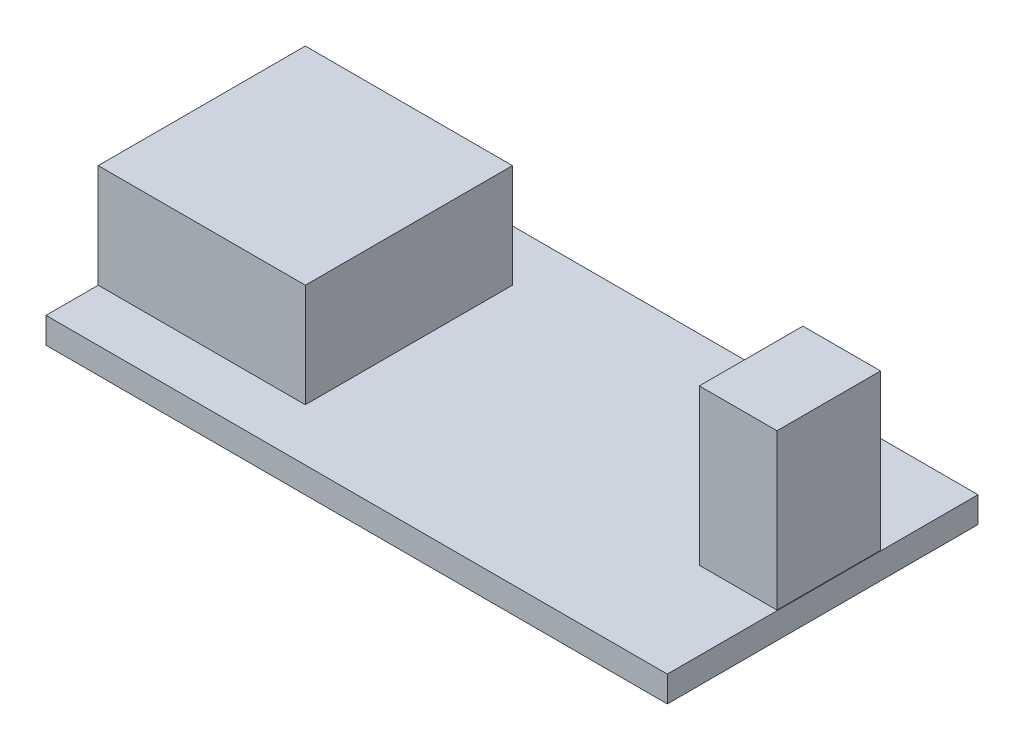
ISO-10303-21;
HEADER;
FILE_DESCRIPTION(('STEP AP214'),'2;1');
FILE_NAME('part.step','',(''),(''),'','','');
FILE_SCHEMA(('AUTOMOTIVE_DESIGN { 1 0 10303 214 1 1 1 1 }'));
ENDSEC;
DATA;
#1=APPLICATION_CONTEXT('core data for automotive mechanical design processes');
#2=APPLICATION_PROTOCOL_DEFINITION('international standard','automotive_design',2000,#1);
#3=PRODUCT_CONTEXT('',#1,'mechanical');
#4=PRODUCT('Part','Part','',(#3));
#5=PRODUCT_RELATED_PRODUCT_CATEGORY('part','',(#4));
#6=PRODUCT_DEFINITION_FORMATION('','',#4);
#7=PRODUCT_DEFINITION_CONTEXT('part definition',#1,'design');
#8=PRODUCT_DEFINITION('design','',#6,#7);
#9=PRODUCT_DEFINITION_SHAPE('','',#8);
#10=(LENGTH_UNIT() NAMED_UNIT(*) SI_UNIT(.MILLI.,.METRE.));
#11=(NAMED_UNIT(*) PLANE_ANGLE_UNIT() SI_UNIT($,.RADIAN.));
#12=(NAMED_UNIT(*) SI_UNIT($,.STERADIAN.) SOLID_ANGLE_UNIT());
#13=UNCERTAINTY_MEASURE_WITH_UNIT(LENGTH_MEASURE(1.E-05),#10,'distance_accuracy_value','');
#14=(GEOMETRIC_REPRESENTATION_CONTEXT(3) GLOBAL_UNCERTAINTY_ASSIGNED_CONTEXT((#13)) GLOBAL_UNIT_ASSIGNED_CONTEXT((#10,
#11,#12)) REPRESENTATION_CONTEXT('',''));
#15=CARTESIAN_POINT('',(0.,0.,0.));
#16=DIRECTION('',(0.,0.,1.));
#17=DIRECTION('',(1.,0.,0.));
#18=AXIS2_PLACEMENT_3D('',#15,#16,#17);
#19=CARTESIAN_POINT('',(0.,12.7,0.));
#20=DIRECTION('',(0.,-1.,0.));
#21=DIRECTION('',(0.,0.,-1.));
#22=AXIS2_PLACEMENT_3D('',#19,#20,#21);
#23=PLANE('',#22);
#24=DIRECTION('',(0.,0.,1.));
#25=VECTOR('',#24,1.);
#26=CARTESIAN_POINT('',(114.020932653844,12.7,-28.6671947155262));
#27=LINE('',#26,#25);
#28=CARTESIAN_POINT('',(114.020932653844,12.7,-28.6671947155262));
#29=VERTEX_POINT('',#28);
#30=CARTESIAN_POINT('',(114.020932653844,12.7,22.1328052844738));
#31=VERTEX_POINT('',#30);
#32=EDGE_CURVE('E155',#29,#31,#27,.T.);
#33=ORIENTED_EDGE('',*,*,#32,.F.);
#34=DIRECTION('',(-1.,0.,0.));
#35=VECTOR('',#34,1.);
#36=CARTESIAN_POINT('',(114.020932653844,12.7,-28.6671947155262));
#37=LINE('',#36,#35);
#38=CARTESIAN_POINT('',(152.120932653844,12.7,-28.6671947155262));
#39=VERTEX_POINT('',#38);
#40=EDGE_CURVE('E168',#39,#29,#37,.T.);
#41=ORIENTED_EDGE('',*,*,#40,.F.);
#42=DIRECTION('',(0.,0.,-1.));
#43=VECTOR('',#42,1.);
#44=CARTESIAN_POINT('',(152.120932653844,12.7,-28.6671947155262));
#45=LINE('',#44,#43);
#46=CARTESIAN_POINT('',(152.120932653844,12.7,22.1328052844738));
#47=VERTEX_POINT('',#46);
#48=EDGE_CURVE('E177',#47,#39,#45,.T.);
#49=ORIENTED_EDGE('',*,*,#48,.F.);
#50=DIRECTION('',(1.,0.,0.));
#51=VECTOR('',#50,1.);
#52=CARTESIAN_POINT('',(114.020932653844,12.7,22.1328052844738));
#53=LINE('',#52,#51);
#54=EDGE_CURVE('E158',#31,#47,#53,.T.);
#55=ORIENTED_EDGE('',*,*,#54,.F.);
#56=EDGE_LOOP('',(#33,#41,#49,#55));
#57=FACE_BOUND('',#56,.T.);
#58=DIRECTION('',(1.,0.,0.));
#59=VECTOR('',#58,1.);
#60=CARTESIAN_POINT('',(-50.8,12.7,50.5821110994876));
#61=LINE('',#60,#59);
#62=CARTESIAN_POINT('',(-152.4,12.7,50.5821110994876));
#63=VERTEX_POINT('',#62);
#64=CARTESIAN_POINT('',(-50.8,12.7,50.5821110994876));
#65=VERTEX_POINT('',#64);
#66=EDGE_CURVE('E232',#63,#65,#61,.T.);
#67=ORIENTED_EDGE('',*,*,#66,.F.);
#68=DIRECTION('',(0.,0.,1.));
#69=VECTOR('',#68,1.);
#70=CARTESIAN_POINT('',(-152.4,12.7,76.2));
#71=LINE('',#70,#69);
#72=CARTESIAN_POINT('',(-152.4,12.7,76.2));
#73=VERTEX_POINT('',#72);
#74=EDGE_CURVE('E154',#63,#73,#71,.T.);
#75=ORIENTED_EDGE('',*,*,#74,.T.);
#76=DIRECTION('',(1.,0.,0.));
#77=VECTOR('',#76,1.);
#78=CARTESIAN_POINT('',(-152.4,12.7,76.2));
#79=LINE('',#78,#77);
#80=CARTESIAN_POINT('',(152.4,12.7,76.2));
#81=VERTEX_POINT('',#80);
#82=EDGE_CURVE('E202',#73,#81,#79,.T.);
#83=ORIENTED_EDGE('',*,*,#82,.T.);
#84=DIRECTION('',(0.,0.,-1.));
#85=VECTOR('',#84,1.);
#86=CARTESIAN_POINT('',(152.4,12.7,76.2));
#87=LINE('',#86,#85);
#88=CARTESIAN_POINT('',(152.4,12.7,-76.2));
#89=VERTEX_POINT('',#88);
#90=EDGE_CURVE('E194',#81,#89,#87,.T.);
#91=ORIENTED_EDGE('',*,*,#90,.T.);
#92=DIRECTION('',(-1.,0.,0.));
#93=VECTOR('',#92,1.);
#94=CARTESIAN_POINT('',(-152.4,12.7,-76.2));
#95=LINE('',#94,#93);
#96=CARTESIAN_POINT('',(-152.4,12.7,-76.2));
#97=VERTEX_POINT('',#96);
#98=EDGE_CURVE('E197',#89,#97,#95,.T.);
#99=ORIENTED_EDGE('',*,*,#98,.T.);
#100=CARTESIAN_POINT('',(-152.4,12.7,-51.0178889005123));
#101=VERTEX_POINT('',#100);
#102=EDGE_CURVE('E200',#97,#101,#71,.T.);
#103=ORIENTED_EDGE('',*,*,#102,.T.);
#104=DIRECTION('',(-1.,0.,0.));
#105=VECTOR('',#104,1.);
#106=CARTESIAN_POINT('',(-50.8,12.7,-51.0178889005124));
#107=LINE('',#106,#105);
#108=CARTESIAN_POINT('',(-50.8,12.7,-51.0178889005124));
#109=VERTEX_POINT('',#108);
#110=EDGE_CURVE('E64',#109,#101,#107,.T.);
#111=ORIENTED_EDGE('',*,*,#110,.F.);
#112=DIRECTION('',(0.,0.,-1.));
#113=VECTOR('',#112,1.);
#114=CARTESIAN_POINT('',(-50.8,12.7,50.5821110994876));
#115=LINE('',#114,#113);
#116=EDGE_CURVE('E59',#65,#109,#115,.T.);
#117=ORIENTED_EDGE('',*,*,#116,.F.);
#118=EDGE_LOOP('',(#67,#75,#83,#91,#99,#103,#111,#117));
#119=FACE_BOUND('',#118,.T.);
#120=ADVANCED_FACE('F44',(#57,#119),#23,.F.);
#121=CARTESIAN_POINT('',(152.4,12.7,76.2));
#122=DIRECTION('',(-1.,0.,0.));
#123=DIRECTION('',(0.,0.,1.));
#124=AXIS2_PLACEMENT_3D('',#121,#122,#123);
#125=PLANE('',#124);
#126=DIRECTION('',(0.,0.,-1.));
#127=VECTOR('',#126,1.);
#128=CARTESIAN_POINT('',(152.4,0.,76.2));
#129=LINE('',#128,#127);
#130=CARTESIAN_POINT('',(152.4,0.,76.2));
#131=VERTEX_POINT('',#130);
#132=CARTESIAN_POINT('',(152.4,0.,-76.2));
#133=VERTEX_POINT('',#132);
#134=EDGE_CURVE('E193',#131,#133,#129,.T.);
#135=ORIENTED_EDGE('',*,*,#134,.T.);
#136=DIRECTION('',(0.,-1.,0.));
#137=VECTOR('',#136,1.);
#138=CARTESIAN_POINT('',(152.4,12.7,-76.2));
#139=LINE('',#138,#137);
#140=EDGE_CURVE('E11',#89,#133,#139,.T.);
#141=ORIENTED_EDGE('',*,*,#140,.F.);
#142=ORIENTED_EDGE('',*,*,#90,.F.);
#143=DIRECTION('',(0.,-1.,0.));
#144=VECTOR('',#143,1.);
#145=CARTESIAN_POINT('',(152.4,12.7,76.2));
#146=LINE('',#145,#144);
#147=EDGE_CURVE('E204',#81,#131,#146,.T.);
#148=ORIENTED_EDGE('',*,*,#147,.T.);
#149=EDGE_LOOP('',(#135,#141,#142,#148));
#150=FACE_BOUND('',#149,.T.);
#151=ADVANCED_FACE('F46',(#150),#125,.F.);
#152=CARTESIAN_POINT('',(-152.4,12.7,-76.2));
#153=DIRECTION('',(0.,0.,1.));
#154=DIRECTION('',(1.,0.,0.));
#155=AXIS2_PLACEMENT_3D('',#152,#153,#154);
#156=PLANE('',#155);
#157=DIRECTION('',(-1.,0.,0.));
#158=VECTOR('',#157,1.);
#159=CARTESIAN_POINT('',(-152.4,0.,-76.2));
#160=LINE('',#159,#158);
#161=CARTESIAN_POINT('',(-152.4,0.,-76.2));
#162=VERTEX_POINT('',#161);
#163=EDGE_CURVE('E207',#133,#162,#160,.T.);
#164=ORIENTED_EDGE('',*,*,#163,.T.);
#165=DIRECTION('',(0.,-1.,0.));
#166=VECTOR('',#165,1.);
#167=CARTESIAN_POINT('',(-152.4,12.7,-76.2));
#168=LINE('',#167,#166);
#169=EDGE_CURVE('E52',#97,#162,#168,.T.);
#170=ORIENTED_EDGE('',*,*,#169,.F.);
#171=ORIENTED_EDGE('',*,*,#98,.F.);
#172=ORIENTED_EDGE('',*,*,#140,.T.);
#173=EDGE_LOOP('',(#164,#170,#171,#172));
#174=FACE_BOUND('',#173,.T.);
#175=ADVANCED_FACE('F261',(#174),#156,.F.);
#176=CARTESIAN_POINT('',(-152.4,12.7,76.2));
#177=DIRECTION('',(1.,0.,0.));
#178=DIRECTION('',(0.,0.,-1.));
#179=AXIS2_PLACEMENT_3D('',#176,#177,#178);
#180=PLANE('',#179);
#181=DIRECTION('',(0.,0.,1.));
#182=VECTOR('',#181,1.);
#183=CARTESIAN_POINT('',(-152.4,0.,76.2));
#184=LINE('',#183,#182);
#185=CARTESIAN_POINT('',(-152.4,0.,76.2));
#186=VERTEX_POINT('',#185);
#187=EDGE_CURVE('E209',#162,#186,#184,.T.);
#188=ORIENTED_EDGE('',*,*,#187,.T.);
#189=DIRECTION('',(0.,-1.,0.));
#190=VECTOR('',#189,1.);
#191=CARTESIAN_POINT('',(-152.4,12.7,76.2));
#192=LINE('',#191,#190);
#193=EDGE_CURVE('E214',#73,#186,#192,.T.);
#194=ORIENTED_EDGE('',*,*,#193,.F.);
#195=ORIENTED_EDGE('',*,*,#74,.F.);
#196=DIRECTION('',(0.,-1.,0.));
#197=VECTOR('',#196,1.);
#198=CARTESIAN_POINT('',(-152.4,63.5,50.5821110994876));
#199=LINE('',#198,#197);
#200=CARTESIAN_POINT('',(-152.4,63.5,50.5821110994876));
#201=VERTEX_POINT('',#200);
#202=EDGE_CURVE('E136',#201,#63,#199,.T.);
#203=ORIENTED_EDGE('',*,*,#202,.F.);
#204=DIRECTION('',(0.,0.,1.));
#205=VECTOR('',#204,1.);
#206=CARTESIAN_POINT('',(-152.4,63.5,50.5821110994876));
#207=LINE('',#206,#205);
#208=CARTESIAN_POINT('',(-152.4,63.5,-51.0178889005124));
#209=VERTEX_POINT('',#208);
#210=EDGE_CURVE('E142',#209,#201,#207,.T.);
#211=ORIENTED_EDGE('',*,*,#210,.F.);
#212=DIRECTION('',(0.,-1.,0.));
#213=VECTOR('',#212,1.);
#214=CARTESIAN_POINT('',(-152.4,63.5,-51.0178889005124));
#215=LINE('',#214,#213);
#216=EDGE_CURVE('E239',#209,#101,#215,.T.);
#217=ORIENTED_EDGE('',*,*,#216,.T.);
#218=ORIENTED_EDGE('',*,*,#102,.F.);
#219=ORIENTED_EDGE('',*,*,#169,.T.);
#220=EDGE_LOOP('',(#188,#194,#195,#203,#211,#217,#218,#219));
#221=FACE_BOUND('',#220,.T.);
#222=ADVANCED_FACE('F152',(#221),#180,.F.);
#223=CARTESIAN_POINT('',(-152.4,12.7,76.2));
#224=DIRECTION('',(0.,0.,-1.));
#225=DIRECTION('',(-1.,0.,0.));
#226=AXIS2_PLACEMENT_3D('',#223,#224,#225);
#227=PLANE('',#226);
#228=DIRECTION('',(1.,0.,0.));
#229=VECTOR('',#228,1.);
#230=CARTESIAN_POINT('',(-152.4,0.,76.2));
#231=LINE('',#230,#229);
#232=EDGE_CURVE('E198',#186,#131,#231,.T.);
#233=ORIENTED_EDGE('',*,*,#232,.T.);
#234=ORIENTED_EDGE('',*,*,#147,.F.);
#235=ORIENTED_EDGE('',*,*,#82,.F.);
#236=ORIENTED_EDGE('',*,*,#193,.T.);
#237=EDGE_LOOP('',(#233,#234,#235,#236));
#238=FACE_BOUND('',#237,.T.);
#239=ADVANCED_FACE('F227',(#238),#227,.F.);
#240=CARTESIAN_POINT('',(0.,0.,0.));
#241=DIRECTION('',(0.,-1.,0.));
#242=DIRECTION('',(0.,0.,-1.));
#243=AXIS2_PLACEMENT_3D('',#240,#241,#242);
#244=PLANE('',#243);
#245=ORIENTED_EDGE('',*,*,#134,.F.);
#246=ORIENTED_EDGE('',*,*,#232,.F.);
#247=ORIENTED_EDGE('',*,*,#187,.F.);
#248=ORIENTED_EDGE('',*,*,#163,.F.);
#249=EDGE_LOOP('',(#245,#246,#247,#248));
#250=FACE_BOUND('',#249,.T.);
#251=ADVANCED_FACE('F224',(#250),#244,.T.);
#252=CARTESIAN_POINT('',(114.020932653844,88.9,-28.6671947155262));
#253=DIRECTION('',(1.,0.,0.));
#254=DIRECTION('',(0.,0.,-1.));
#255=AXIS2_PLACEMENT_3D('',#252,#253,#254);
#256=PLANE('',#255);
#257=ORIENTED_EDGE('',*,*,#32,.T.);
#258=DIRECTION('',(0.,-1.,0.));
#259=VECTOR('',#258,1.);
#260=CARTESIAN_POINT('',(114.020932653844,88.9,22.1328052844738));
#261=LINE('',#260,#259);
#262=CARTESIAN_POINT('',(114.020932653844,88.9,22.1328052844738));
#263=VERTEX_POINT('',#262);
#264=EDGE_CURVE('E190',#263,#31,#261,.T.);
#265=ORIENTED_EDGE('',*,*,#264,.F.);
#266=DIRECTION('',(0.,0.,1.));
#267=VECTOR('',#266,1.);
#268=CARTESIAN_POINT('',(114.020932653844,88.9,-28.6671947155262));
#269=LINE('',#268,#267);
#270=CARTESIAN_POINT('',(114.020932653844,88.9,-28.6671947155262));
#271=VERTEX_POINT('',#270);
#272=EDGE_CURVE('E164',#271,#263,#269,.T.);
#273=ORIENTED_EDGE('',*,*,#272,.F.);
#274=DIRECTION('',(0.,-1.,0.));
#275=VECTOR('',#274,1.);
#276=CARTESIAN_POINT('',(114.020932653844,88.9,-28.6671947155262));
#277=LINE('',#276,#275);
#278=EDGE_CURVE('E173',#271,#29,#277,.T.);
#279=ORIENTED_EDGE('',*,*,#278,.T.);
#280=EDGE_LOOP('',(#257,#265,#273,#279));
#281=FACE_BOUND('',#280,.T.);
#282=ADVANCED_FACE('F264',(#281),#256,.F.);
#283=CARTESIAN_POINT('',(114.020932653844,88.9,22.1328052844738));
#284=DIRECTION('',(0.,0.,-1.));
#285=DIRECTION('',(-1.,0.,0.));
#286=AXIS2_PLACEMENT_3D('',#283,#284,#285);
#287=PLANE('',#286);
#288=ORIENTED_EDGE('',*,*,#54,.T.);
#289=DIRECTION('',(0.,-1.,0.));
#290=VECTOR('',#289,1.);
#291=CARTESIAN_POINT('',(152.120932653844,88.9,22.1328052844738));
#292=LINE('',#291,#290);
#293=CARTESIAN_POINT('',(152.120932653844,88.9,22.1328052844738));
#294=VERTEX_POINT('',#293);
#295=EDGE_CURVE('E187',#294,#47,#292,.T.);
#296=ORIENTED_EDGE('',*,*,#295,.F.);
#297=DIRECTION('',(1.,0.,0.));
#298=VECTOR('',#297,1.);
#299=CARTESIAN_POINT('',(114.020932653844,88.9,22.1328052844738));
#300=LINE('',#299,#298);
#301=EDGE_CURVE('E167',#263,#294,#300,.T.);
#302=ORIENTED_EDGE('',*,*,#301,.F.);
#303=ORIENTED_EDGE('',*,*,#264,.T.);
#304=EDGE_LOOP('',(#288,#296,#302,#303));
#305=FACE_BOUND('',#304,.T.);
#306=ADVANCED_FACE('F295',(#305),#287,.F.);
#307=CARTESIAN_POINT('',(152.120932653844,88.9,-28.6671947155262));
#308=DIRECTION('',(-1.,0.,0.));
#309=DIRECTION('',(0.,0.,1.));
#310=AXIS2_PLACEMENT_3D('',#307,#308,#309);
#311=PLANE('',#310);
#312=ORIENTED_EDGE('',*,*,#48,.T.);
#313=DIRECTION('',(0.,-1.,0.));
#314=VECTOR('',#313,1.);
#315=CARTESIAN_POINT('',(152.120932653844,88.9,-28.6671947155262));
#316=LINE('',#315,#314);
#317=CARTESIAN_POINT('',(152.120932653844,88.9,-28.6671947155262));
#318=VERTEX_POINT('',#317);
#319=EDGE_CURVE('E184',#318,#39,#316,.T.);
#320=ORIENTED_EDGE('',*,*,#319,.F.);
#321=DIRECTION('',(0.,0.,-1.));
#322=VECTOR('',#321,1.);
#323=CARTESIAN_POINT('',(152.120932653844,88.9,-28.6671947155262));
#324=LINE('',#323,#322);
#325=EDGE_CURVE('E170',#294,#318,#324,.T.);
#326=ORIENTED_EDGE('',*,*,#325,.F.);
#327=ORIENTED_EDGE('',*,*,#295,.T.);
#328=EDGE_LOOP('',(#312,#320,#326,#327));
#329=FACE_BOUND('',#328,.T.);
#330=ADVANCED_FACE('F302',(#329),#311,.F.);
#331=CARTESIAN_POINT('',(114.020932653844,88.9,-28.6671947155262));
#332=DIRECTION('',(0.,0.,1.));
#333=DIRECTION('',(1.,0.,0.));
#334=AXIS2_PLACEMENT_3D('',#331,#332,#333);
#335=PLANE('',#334);
#336=ORIENTED_EDGE('',*,*,#40,.T.);
#337=ORIENTED_EDGE('',*,*,#278,.F.);
#338=DIRECTION('',(-1.,0.,0.));
#339=VECTOR('',#338,1.);
#340=CARTESIAN_POINT('',(114.020932653844,88.9,-28.6671947155262));
#341=LINE('',#340,#339);
#342=EDGE_CURVE('E172',#318,#271,#341,.T.);
#343=ORIENTED_EDGE('',*,*,#342,.F.);
#344=ORIENTED_EDGE('',*,*,#319,.T.);
#345=EDGE_LOOP('',(#336,#337,#343,#344));
#346=FACE_BOUND('',#345,.T.);
#347=ADVANCED_FACE('F309',(#346),#335,.F.);
#348=CARTESIAN_POINT('',(0.,88.9,0.));
#349=DIRECTION('',(0.,1.,0.));
#350=DIRECTION('',(0.,0.,1.));
#351=AXIS2_PLACEMENT_3D('',#348,#349,#350);
#352=PLANE('',#351);
#353=ORIENTED_EDGE('',*,*,#272,.T.);
#354=ORIENTED_EDGE('',*,*,#301,.T.);
#355=ORIENTED_EDGE('',*,*,#325,.T.);
#356=ORIENTED_EDGE('',*,*,#342,.T.);
#357=EDGE_LOOP('',(#353,#354,#355,#356));
#358=FACE_BOUND('',#357,.T.);
#359=ADVANCED_FACE('F253',(#358),#352,.T.);
#360=CARTESIAN_POINT('',(-50.8,63.5,50.5821110994876));
#361=DIRECTION('',(0.,0.,-1.));
#362=DIRECTION('',(-1.,0.,0.));
#363=AXIS2_PLACEMENT_3D('',#360,#361,#362);
#364=PLANE('',#363);
#365=ORIENTED_EDGE('',*,*,#66,.T.);
#366=DIRECTION('',(0.,-1.,0.));
#367=VECTOR('',#366,1.);
#368=CARTESIAN_POINT('',(-50.8,63.5,50.5821110994876));
#369=LINE('',#368,#367);
#370=CARTESIAN_POINT('',(-50.8,63.5,50.5821110994876));
#371=VERTEX_POINT('',#370);
#372=EDGE_CURVE('E138',#371,#65,#369,.T.);
#373=ORIENTED_EDGE('',*,*,#372,.F.);
#374=DIRECTION('',(1.,0.,0.));
#375=VECTOR('',#374,1.);
#376=CARTESIAN_POINT('',(-50.8,63.5,50.5821110994876));
#377=LINE('',#376,#375);
#378=EDGE_CURVE('E132',#201,#371,#377,.T.);
#379=ORIENTED_EDGE('',*,*,#378,.F.);
#380=ORIENTED_EDGE('',*,*,#202,.T.);
#381=EDGE_LOOP('',(#365,#373,#379,#380));
#382=FACE_BOUND('',#381,.T.);
#383=ADVANCED_FACE('F134',(#382),#364,.F.);
#384=CARTESIAN_POINT('',(-50.8,63.5,50.5821110994876));
#385=DIRECTION('',(-1.,0.,0.));
#386=DIRECTION('',(0.,0.,1.));
#387=AXIS2_PLACEMENT_3D('',#384,#385,#386);
#388=PLANE('',#387);
#389=ORIENTED_EDGE('',*,*,#116,.T.);
#390=DIRECTION('',(0.,-1.,0.));
#391=VECTOR('',#390,1.);
#392=CARTESIAN_POINT('',(-50.8,63.5,-51.0178889005124));
#393=LINE('',#392,#391);
#394=CARTESIAN_POINT('',(-50.8,63.5,-51.0178889005124));
#395=VERTEX_POINT('',#394);
#396=EDGE_CURVE('E160',#395,#109,#393,.T.);
#397=ORIENTED_EDGE('',*,*,#396,.F.);
#398=DIRECTION('',(0.,0.,-1.));
#399=VECTOR('',#398,1.);
#400=CARTESIAN_POINT('',(-50.8,63.5,50.5821110994876));
#401=LINE('',#400,#399);
#402=EDGE_CURVE('E141',#371,#395,#401,.T.);
#403=ORIENTED_EDGE('',*,*,#402,.F.);
#404=ORIENTED_EDGE('',*,*,#372,.T.);
#405=EDGE_LOOP('',(#389,#397,#403,#404));
#406=FACE_BOUND('',#405,.T.);
#407=ADVANCED_FACE('F245',(#406),#388,.F.);
#408=CARTESIAN_POINT('',(-50.8,63.5,-51.0178889005124));
#409=DIRECTION('',(0.,0.,1.));
#410=DIRECTION('',(1.,0.,0.));
#411=AXIS2_PLACEMENT_3D('',#408,#409,#410);
#412=PLANE('',#411);
#413=ORIENTED_EDGE('',*,*,#110,.T.);
#414=ORIENTED_EDGE('',*,*,#216,.F.);
#415=DIRECTION('',(-1.,0.,0.));
#416=VECTOR('',#415,1.);
#417=CARTESIAN_POINT('',(-50.8,63.5,-51.0178889005124));
#418=LINE('',#417,#416);
#419=EDGE_CURVE('E147',#395,#209,#418,.T.);
#420=ORIENTED_EDGE('',*,*,#419,.F.);
#421=ORIENTED_EDGE('',*,*,#396,.T.);
#422=EDGE_LOOP('',(#413,#414,#420,#421));
#423=FACE_BOUND('',#422,.T.);
#424=ADVANCED_FACE('F243',(#423),#412,.F.);
#425=CARTESIAN_POINT('',(0.,63.5,0.));
#426=DIRECTION('',(0.,1.,0.));
#427=DIRECTION('',(0.,0.,1.));
#428=AXIS2_PLACEMENT_3D('',#425,#426,#427);
#429=PLANE('',#428);
#430=ORIENTED_EDGE('',*,*,#210,.T.);
#431=ORIENTED_EDGE('',*,*,#378,.T.);
#432=ORIENTED_EDGE('',*,*,#402,.T.);
#433=ORIENTED_EDGE('',*,*,#419,.T.);
#434=EDGE_LOOP('',(#430,#431,#432,#433));
#435=FACE_BOUND('',#434,.T.);
#436=ADVANCED_FACE('F145',(#435),#429,.T.);
#437=CLOSED_SHELL('',(#120,#151,#175,#222,#239,#251,#282,#306,#330,#347,#359,#383,#407,#424,#436));
#438=MANIFOLD_SOLID_BREP('B2',#437);
#439=ADVANCED_BREP_SHAPE_REPRESENTATION('',(#18,#438),#14);
#440=SHAPE_DEFINITION_REPRESENTATION(#9,#439);
ENDSEC;
END-ISO-10303-21;
